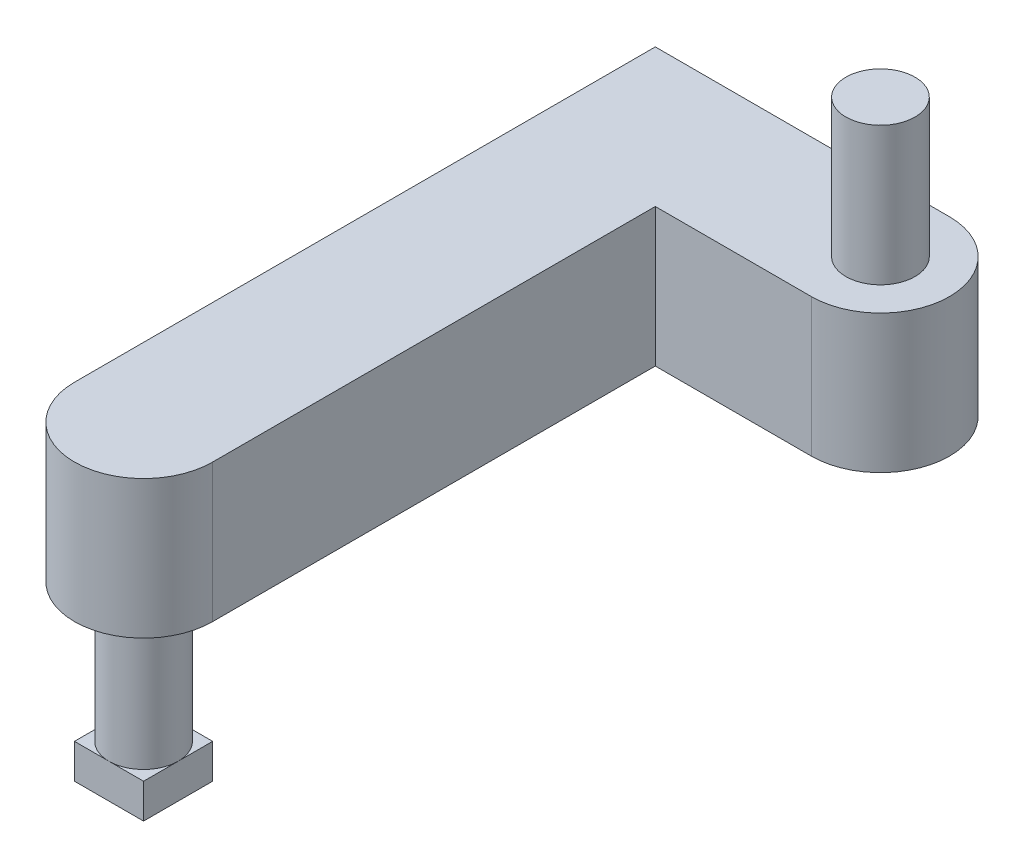
ISO-10303-21;
HEADER;
FILE_DESCRIPTION(('STEP AP214'),'2;1');
FILE_NAME('part.step','',(''),(''),'','','');
FILE_SCHEMA(('AUTOMOTIVE_DESIGN { 1 0 10303 214 1 1 1 1 }'));
ENDSEC;
DATA;
#1=APPLICATION_CONTEXT('core data for automotive mechanical design processes');
#2=APPLICATION_PROTOCOL_DEFINITION('international standard','automotive_design',2000,#1);
#3=PRODUCT_CONTEXT('',#1,'mechanical');
#4=PRODUCT('Part','Part','',(#3));
#5=PRODUCT_RELATED_PRODUCT_CATEGORY('part','',(#4));
#6=PRODUCT_DEFINITION_FORMATION('','',#4);
#7=PRODUCT_DEFINITION_CONTEXT('part definition',#1,'design');
#8=PRODUCT_DEFINITION('design','',#6,#7);
#9=PRODUCT_DEFINITION_SHAPE('','',#8);
#10=(LENGTH_UNIT() NAMED_UNIT(*) SI_UNIT(.MILLI.,.METRE.));
#11=(NAMED_UNIT(*) PLANE_ANGLE_UNIT() SI_UNIT($,.RADIAN.));
#12=(NAMED_UNIT(*) SI_UNIT($,.STERADIAN.) SOLID_ANGLE_UNIT());
#13=UNCERTAINTY_MEASURE_WITH_UNIT(LENGTH_MEASURE(1.E-05),#10,'distance_accuracy_value','');
#14=(GEOMETRIC_REPRESENTATION_CONTEXT(3) GLOBAL_UNCERTAINTY_ASSIGNED_CONTEXT((#13)) GLOBAL_UNIT_ASSIGNED_CONTEXT((#10,
#11,#12)) REPRESENTATION_CONTEXT('',''));
#15=CARTESIAN_POINT('',(0.,0.,0.));
#16=DIRECTION('',(0.,0.,1.));
#17=DIRECTION('',(1.,0.,0.));
#18=AXIS2_PLACEMENT_3D('',#15,#16,#17);
#19=CARTESIAN_POINT('',(-295.,-10.,0.));
#20=DIRECTION('',(-1.,0.,0.));
#21=DIRECTION('',(0.,0.,1.));
#22=AXIS2_PLACEMENT_3D('',#19,#20,#21);
#23=PLANE('',#22);
#24=DIRECTION('',(0.,0.,-1.));
#25=VECTOR('',#24,1.);
#26=CARTESIAN_POINT('',(-295.,-20.,0.));
#27=LINE('',#26,#25);
#28=CARTESIAN_POINT('',(-295.,-20.,632.19854476264));
#29=VERTEX_POINT('',#28);
#30=CARTESIAN_POINT('',(-295.,-20.,590.172180289074));
#31=VERTEX_POINT('',#30);
#32=EDGE_CURVE('E177',#29,#31,#27,.T.);
#33=ORIENTED_EDGE('',*,*,#32,.F.);
#34=DIRECTION('',(0.,-1.,0.));
#35=VECTOR('',#34,1.);
#36=CARTESIAN_POINT('',(-295.,-10.,632.19854476264));
#37=LINE('',#36,#35);
#38=CARTESIAN_POINT('',(-295.,-10.,632.19854476264));
#39=VERTEX_POINT('',#38);
#40=EDGE_CURVE('E42',#39,#29,#37,.T.);
#41=ORIENTED_EDGE('',*,*,#40,.F.);
#42=DIRECTION('',(0.,0.,-1.));
#43=VECTOR('',#42,1.);
#44=CARTESIAN_POINT('',(-295.,-10.,0.));
#45=LINE('',#44,#43);
#46=CARTESIAN_POINT('',(-295.,-10.,590.172180289074));
#47=VERTEX_POINT('',#46);
#48=EDGE_CURVE('E179',#39,#47,#45,.T.);
#49=ORIENTED_EDGE('',*,*,#48,.T.);
#50=DIRECTION('',(0.,-1.,0.));
#51=VECTOR('',#50,1.);
#52=CARTESIAN_POINT('',(-295.,-10.,590.172180289074));
#53=LINE('',#52,#51);
#54=EDGE_CURVE('E195',#47,#31,#53,.T.);
#55=ORIENTED_EDGE('',*,*,#54,.T.);
#56=EDGE_LOOP('',(#33,#41,#49,#55));
#57=FACE_BOUND('',#56,.T.);
#58=ADVANCED_FACE('F35',(#57),#23,.T.);
#59=CARTESIAN_POINT('',(-290.,-10.,632.19854476264));
#60=DIRECTION('',(0.,-1.,0.));
#61=DIRECTION('',(0.,0.,-1.));
#62=AXIS2_PLACEMENT_3D('',#59,#60,#61);
#63=CYLINDRICAL_SURFACE('',#62,5.);
#64=CARTESIAN_POINT('',(-290.,-20.,632.19854476264));
#65=DIRECTION('',(0.,1.,0.));
#66=DIRECTION('',(0.,0.,1.));
#67=AXIS2_PLACEMENT_3D('',#64,#65,#66);
#68=CIRCLE('',#67,5.);
#69=CARTESIAN_POINT('',(-285.,-20.,632.19854476264));
#70=VERTEX_POINT('',#69);
#71=EDGE_CURVE('E198',#70,#29,#68,.F.);
#72=ORIENTED_EDGE('',*,*,#71,.F.);
#73=DIRECTION('',(0.,-1.,0.));
#74=VECTOR('',#73,1.);
#75=CARTESIAN_POINT('',(-285.,-10.,632.19854476264));
#76=LINE('',#75,#74);
#77=CARTESIAN_POINT('',(-285.,-10.,632.19854476264));
#78=VERTEX_POINT('',#77);
#79=EDGE_CURVE('E219',#78,#70,#76,.T.);
#80=ORIENTED_EDGE('',*,*,#79,.F.);
#81=CARTESIAN_POINT('',(-290.,-10.,632.19854476264));
#82=DIRECTION('',(0.,1.,0.));
#83=DIRECTION('',(0.,0.,1.));
#84=AXIS2_PLACEMENT_3D('',#81,#82,#83);
#85=CIRCLE('',#84,5.);
#86=EDGE_CURVE('E182',#78,#39,#85,.F.);
#87=ORIENTED_EDGE('',*,*,#86,.T.);
#88=ORIENTED_EDGE('',*,*,#40,.T.);
#89=EDGE_LOOP('',(#72,#80,#87,#88));
#90=FACE_BOUND('',#89,.T.);
#91=ADVANCED_FACE('F223',(#90),#63,.T.);
#92=CARTESIAN_POINT('',(-285.,-10.,0.));
#93=DIRECTION('',(-1.,0.,0.));
#94=DIRECTION('',(0.,0.,1.));
#95=AXIS2_PLACEMENT_3D('',#92,#93,#94);
#96=PLANE('',#95);
#97=DIRECTION('',(0.,0.,-1.));
#98=VECTOR('',#97,1.);
#99=CARTESIAN_POINT('',(-285.,-20.,0.));
#100=LINE('',#99,#98);
#101=CARTESIAN_POINT('',(-285.,-20.,600.172180289074));
#102=VERTEX_POINT('',#101);
#103=EDGE_CURVE('E201',#70,#102,#100,.T.);
#104=ORIENTED_EDGE('',*,*,#103,.T.);
#105=DIRECTION('',(0.,-1.,0.));
#106=VECTOR('',#105,1.);
#107=CARTESIAN_POINT('',(-285.,-10.,600.172180289074));
#108=LINE('',#107,#106);
#109=CARTESIAN_POINT('',(-285.,-10.,600.172180289074));
#110=VERTEX_POINT('',#109);
#111=EDGE_CURVE('E216',#110,#102,#108,.T.);
#112=ORIENTED_EDGE('',*,*,#111,.F.);
#113=DIRECTION('',(0.,0.,-1.));
#114=VECTOR('',#113,1.);
#115=CARTESIAN_POINT('',(-285.,-10.,0.));
#116=LINE('',#115,#114);
#117=EDGE_CURVE('E186',#78,#110,#116,.T.);
#118=ORIENTED_EDGE('',*,*,#117,.F.);
#119=ORIENTED_EDGE('',*,*,#79,.T.);
#120=EDGE_LOOP('',(#104,#112,#118,#119));
#121=FACE_BOUND('',#120,.T.);
#122=ADVANCED_FACE('F235',(#121),#96,.F.);
#123=CARTESIAN_POINT('',(5.9020530676747E-12,-10.,600.172180289071));
#124=DIRECTION('',(0.,0.,-1.));
#125=DIRECTION('',(-1.,0.,0.));
#126=AXIS2_PLACEMENT_3D('',#123,#124,#125);
#127=PLANE('',#126);
#128=DIRECTION('',(1.,0.,0.));
#129=VECTOR('',#128,1.);
#130=CARTESIAN_POINT('',(5.9020530676747E-12,-20.,600.172180289071));
#131=LINE('',#130,#129);
#132=CARTESIAN_POINT('',(-273.710284952437,-20.,600.172180289074));
#133=VERTEX_POINT('',#132);
#134=EDGE_CURVE('E203',#102,#133,#131,.T.);
#135=ORIENTED_EDGE('',*,*,#134,.T.);
#136=DIRECTION('',(0.,-1.,0.));
#137=VECTOR('',#136,1.);
#138=CARTESIAN_POINT('',(-273.710284952437,-10.,600.172180289074));
#139=LINE('',#138,#137);
#140=CARTESIAN_POINT('',(-273.710284952437,-10.,600.172180289074));
#141=VERTEX_POINT('',#140);
#142=EDGE_CURVE('E213',#141,#133,#139,.T.);
#143=ORIENTED_EDGE('',*,*,#142,.F.);
#144=DIRECTION('',(1.,0.,0.));
#145=VECTOR('',#144,1.);
#146=CARTESIAN_POINT('',(5.9020530676747E-12,-10.,600.172180289071));
#147=LINE('',#146,#145);
#148=EDGE_CURVE('E188',#110,#141,#147,.T.);
#149=ORIENTED_EDGE('',*,*,#148,.F.);
#150=ORIENTED_EDGE('',*,*,#111,.T.);
#151=EDGE_LOOP('',(#135,#143,#149,#150));
#152=FACE_BOUND('',#151,.T.);
#153=ADVANCED_FACE('F239',(#152),#127,.F.);
#154=CARTESIAN_POINT('',(-273.710284952437,-10.,595.172180289074));
#155=DIRECTION('',(0.,-1.,0.));
#156=DIRECTION('',(0.,0.,-1.));
#157=AXIS2_PLACEMENT_3D('',#154,#155,#156);
#158=CYLINDRICAL_SURFACE('',#157,5.);
#159=CARTESIAN_POINT('',(-273.710284952437,-20.,595.172180289074));
#160=DIRECTION('',(0.,1.,0.));
#161=DIRECTION('',(0.,0.,1.));
#162=AXIS2_PLACEMENT_3D('',#159,#160,#161);
#163=CIRCLE('',#162,5.);
#164=CARTESIAN_POINT('',(-273.710284952437,-20.,590.172180289074));
#165=VERTEX_POINT('',#164);
#166=EDGE_CURVE('E205',#133,#165,#163,.T.);
#167=ORIENTED_EDGE('',*,*,#166,.T.);
#168=DIRECTION('',(0.,-1.,0.));
#169=VECTOR('',#168,1.);
#170=CARTESIAN_POINT('',(-273.710284952437,-10.,590.172180289074));
#171=LINE('',#170,#169);
#172=CARTESIAN_POINT('',(-273.710284952437,-10.,590.172180289074));
#173=VERTEX_POINT('',#172);
#174=EDGE_CURVE('E211',#173,#165,#171,.T.);
#175=ORIENTED_EDGE('',*,*,#174,.F.);
#176=CARTESIAN_POINT('',(-273.710284952437,-10.,595.172180289074));
#177=DIRECTION('',(0.,1.,0.));
#178=DIRECTION('',(0.,0.,1.));
#179=AXIS2_PLACEMENT_3D('',#176,#177,#178);
#180=CIRCLE('',#179,5.);
#181=EDGE_CURVE('E190',#141,#173,#180,.T.);
#182=ORIENTED_EDGE('',*,*,#181,.F.);
#183=ORIENTED_EDGE('',*,*,#142,.T.);
#184=EDGE_LOOP('',(#167,#175,#182,#183));
#185=FACE_BOUND('',#184,.T.);
#186=ADVANCED_FACE('F249',(#185),#158,.T.);
#187=CARTESIAN_POINT('',(3.07764919157606E-12,-10.,590.172180289072));
#188=DIRECTION('',(0.,0.,-1.));
#189=DIRECTION('',(-1.,0.,0.));
#190=AXIS2_PLACEMENT_3D('',#187,#188,#189);
#191=PLANE('',#190);
#192=DIRECTION('',(1.,0.,0.));
#193=VECTOR('',#192,1.);
#194=CARTESIAN_POINT('',(3.07764919157606E-12,-20.,590.172180289072));
#195=LINE('',#194,#193);
#196=EDGE_CURVE('E183',#31,#165,#195,.T.);
#197=ORIENTED_EDGE('',*,*,#196,.F.);
#198=ORIENTED_EDGE('',*,*,#54,.F.);
#199=DIRECTION('',(1.,0.,0.));
#200=VECTOR('',#199,1.);
#201=CARTESIAN_POINT('',(3.07764919157606E-12,-10.,590.172180289072));
#202=LINE('',#201,#200);
#203=EDGE_CURVE('E192',#47,#173,#202,.T.);
#204=ORIENTED_EDGE('',*,*,#203,.T.);
#205=ORIENTED_EDGE('',*,*,#174,.T.);
#206=EDGE_LOOP('',(#197,#198,#204,#205));
#207=FACE_BOUND('',#206,.T.);
#208=ADVANCED_FACE('F247',(#207),#191,.T.);
#209=CARTESIAN_POINT('',(0.,-10.,0.));
#210=DIRECTION('',(0.,1.,0.));
#211=DIRECTION('',(0.,0.,1.));
#212=AXIS2_PLACEMENT_3D('',#209,#210,#211);
#213=PLANE('',#212);
#214=CARTESIAN_POINT('',(-273.710284952437,-10.,595.172180289074));
#215=DIRECTION('',(0.,1.,0.));
#216=DIRECTION('',(0.,0.,1.));
#217=AXIS2_PLACEMENT_3D('',#214,#215,#216);
#218=CIRCLE('',#217,2.50000000000002);
#219=CARTESIAN_POINT('',(-273.710284952437,-10.,597.672180289074));
#220=VERTEX_POINT('',#219);
#221=EDGE_CURVE('E154',#220,#220,#218,.F.);
#222=ORIENTED_EDGE('',*,*,#221,.T.);
#223=EDGE_LOOP('',(#222));
#224=FACE_BOUND('',#223,.T.);
#225=ORIENTED_EDGE('',*,*,#48,.F.);
#226=ORIENTED_EDGE('',*,*,#86,.F.);
#227=ORIENTED_EDGE('',*,*,#117,.T.);
#228=ORIENTED_EDGE('',*,*,#148,.T.);
#229=ORIENTED_EDGE('',*,*,#181,.T.);
#230=ORIENTED_EDGE('',*,*,#203,.F.);
#231=EDGE_LOOP('',(#225,#226,#227,#228,#229,#230));
#232=FACE_BOUND('',#231,.T.);
#233=ADVANCED_FACE('F243',(#224,#232),#213,.T.);
#234=CARTESIAN_POINT('',(0.,-20.,0.));
#235=DIRECTION('',(0.,1.,0.));
#236=DIRECTION('',(0.,0.,1.));
#237=AXIS2_PLACEMENT_3D('',#234,#235,#236);
#238=PLANE('',#237);
#239=CARTESIAN_POINT('',(-290.,-20.,632.19854476264));
#240=DIRECTION('',(0.,1.,0.));
#241=DIRECTION('',(0.,0.,1.));
#242=AXIS2_PLACEMENT_3D('',#239,#240,#241);
#243=CIRCLE('',#242,2.49999999999995);
#244=CARTESIAN_POINT('',(-290.,-20.,634.69854476264));
#245=VERTEX_POINT('',#244);
#246=EDGE_CURVE('E11',#245,#245,#243,.F.);
#247=ORIENTED_EDGE('',*,*,#246,.F.);
#248=EDGE_LOOP('',(#247));
#249=FACE_BOUND('',#248,.T.);
#250=ORIENTED_EDGE('',*,*,#32,.T.);
#251=ORIENTED_EDGE('',*,*,#196,.T.);
#252=ORIENTED_EDGE('',*,*,#166,.F.);
#253=ORIENTED_EDGE('',*,*,#134,.F.);
#254=ORIENTED_EDGE('',*,*,#103,.F.);
#255=ORIENTED_EDGE('',*,*,#71,.T.);
#256=EDGE_LOOP('',(#250,#251,#252,#253,#254,#255));
#257=FACE_BOUND('',#256,.T.);
#258=ADVANCED_FACE('F230',(#249,#257),#238,.F.);
#259=CARTESIAN_POINT('',(-290.,-30.,632.19854476264));
#260=DIRECTION('',(0.,1.,0.));
#261=DIRECTION('',(0.,0.,1.));
#262=AXIS2_PLACEMENT_3D('',#259,#260,#261);
#263=CYLINDRICAL_SURFACE('',#262,2.49999999999995);
#264=CARTESIAN_POINT('',(-290.,-30.,632.19854476264));
#265=DIRECTION('',(0.,1.,0.));
#266=DIRECTION('',(0.,0.,1.));
#267=AXIS2_PLACEMENT_3D('',#264,#265,#266);
#268=CIRCLE('',#267,2.49999999999995);
#269=CARTESIAN_POINT('',(-290.,-30.,634.69854476264));
#270=VERTEX_POINT('',#269);
#271=CARTESIAN_POINT('',(-292.5,-30.,632.19854476264));
#272=VERTEX_POINT('',#271);
#273=EDGE_CURVE('E174',#270,#272,#268,.F.);
#274=ORIENTED_EDGE('',*,*,#273,.F.);
#275=CARTESIAN_POINT('',(-287.5,-30.,632.19854476264));
#276=VERTEX_POINT('',#275);
#277=EDGE_CURVE('E49',#276,#270,#268,.F.);
#278=ORIENTED_EDGE('',*,*,#277,.F.);
#279=CARTESIAN_POINT('',(-290.,-30.,629.69854476264));
#280=VERTEX_POINT('',#279);
#281=EDGE_CURVE('E53',#280,#276,#268,.F.);
#282=ORIENTED_EDGE('',*,*,#281,.F.);
#283=EDGE_CURVE('E178',#272,#280,#268,.F.);
#284=ORIENTED_EDGE('',*,*,#283,.F.);
#285=EDGE_LOOP('',(#274,#278,#282,#284));
#286=FACE_BOUND('',#285,.T.);
#287=ORIENTED_EDGE('',*,*,#246,.T.);
#288=EDGE_LOOP('',(#287));
#289=FACE_BOUND('',#288,.T.);
#290=ADVANCED_FACE('F310',(#286,#289),#263,.T.);
#291=CARTESIAN_POINT('',(0.,-30.,0.));
#292=DIRECTION('',(0.,1.,0.));
#293=DIRECTION('',(0.,0.,1.));
#294=AXIS2_PLACEMENT_3D('',#291,#292,#293);
#295=PLANE('',#294);
#296=DIRECTION('',(1.,0.,0.));
#297=VECTOR('',#296,1.);
#298=CARTESIAN_POINT('',(0.,-30.,634.69854476264));
#299=LINE('',#298,#297);
#300=CARTESIAN_POINT('',(-292.5,-30.,634.69854476264));
#301=VERTEX_POINT('',#300);
#302=EDGE_CURVE('E159',#301,#270,#299,.T.);
#303=ORIENTED_EDGE('',*,*,#302,.T.);
#304=ORIENTED_EDGE('',*,*,#273,.T.);
#305=DIRECTION('',(0.,0.,-1.));
#306=VECTOR('',#305,1.);
#307=CARTESIAN_POINT('',(-292.5,-30.,0.));
#308=LINE('',#307,#306);
#309=EDGE_CURVE('E148',#301,#272,#308,.T.);
#310=ORIENTED_EDGE('',*,*,#309,.F.);
#311=EDGE_LOOP('',(#303,#304,#310));
#312=FACE_BOUND('',#311,.T.);
#313=ADVANCED_FACE('F327',(#312),#295,.T.);
#314=CARTESIAN_POINT('',(-292.5,-30.,629.69854476264));
#315=VERTEX_POINT('',#314);
#316=EDGE_CURVE('E151',#272,#315,#308,.T.);
#317=ORIENTED_EDGE('',*,*,#316,.F.);
#318=ORIENTED_EDGE('',*,*,#283,.T.);
#319=DIRECTION('',(1.,0.,0.));
#320=VECTOR('',#319,1.);
#321=CARTESIAN_POINT('',(0.,-30.,629.69854476264));
#322=LINE('',#321,#320);
#323=EDGE_CURVE('E166',#315,#280,#322,.T.);
#324=ORIENTED_EDGE('',*,*,#323,.F.);
#325=EDGE_LOOP('',(#317,#318,#324));
#326=FACE_BOUND('',#325,.T.);
#327=ADVANCED_FACE('F339',(#326),#295,.T.);
#328=CARTESIAN_POINT('',(-287.5,-30.,629.69854476264));
#329=VERTEX_POINT('',#328);
#330=EDGE_CURVE('E165',#280,#329,#322,.T.);
#331=ORIENTED_EDGE('',*,*,#330,.F.);
#332=ORIENTED_EDGE('',*,*,#281,.T.);
#333=DIRECTION('',(0.,0.,-1.));
#334=VECTOR('',#333,1.);
#335=CARTESIAN_POINT('',(-287.5,-30.,0.));
#336=LINE('',#335,#334);
#337=EDGE_CURVE('E162',#276,#329,#336,.T.);
#338=ORIENTED_EDGE('',*,*,#337,.T.);
#339=EDGE_LOOP('',(#331,#332,#338));
#340=FACE_BOUND('',#339,.T.);
#341=ADVANCED_FACE('F350',(#340),#295,.T.);
#342=CARTESIAN_POINT('',(0.,-32.5,634.69854476264));
#343=DIRECTION('',(0.,0.,1.));
#344=DIRECTION('',(1.,0.,0.));
#345=AXIS2_PLACEMENT_3D('',#342,#343,#344);
#346=PLANE('',#345);
#347=ORIENTED_EDGE('',*,*,#302,.F.);
#348=DIRECTION('',(0.,1.,0.));
#349=VECTOR('',#348,1.);
#350=CARTESIAN_POINT('',(-292.5,-32.5,634.69854476264));
#351=LINE('',#350,#349);
#352=CARTESIAN_POINT('',(-292.5,-32.5,634.69854476264));
#353=VERTEX_POINT('',#352);
#354=EDGE_CURVE('E146',#353,#301,#351,.T.);
#355=ORIENTED_EDGE('',*,*,#354,.F.);
#356=DIRECTION('',(1.,0.,0.));
#357=VECTOR('',#356,1.);
#358=CARTESIAN_POINT('',(0.,-32.5,634.69854476264));
#359=LINE('',#358,#357);
#360=CARTESIAN_POINT('',(-287.5,-32.5,634.69854476264));
#361=VERTEX_POINT('',#360);
#362=EDGE_CURVE('E139',#353,#361,#359,.T.);
#363=ORIENTED_EDGE('',*,*,#362,.T.);
#364=DIRECTION('',(0.,1.,0.));
#365=VECTOR('',#364,1.);
#366=CARTESIAN_POINT('',(-287.5,-32.5,634.69854476264));
#367=LINE('',#366,#365);
#368=CARTESIAN_POINT('',(-287.5,-30.,634.69854476264));
#369=VERTEX_POINT('',#368);
#370=EDGE_CURVE('E122',#361,#369,#367,.T.);
#371=ORIENTED_EDGE('',*,*,#370,.T.);
#372=EDGE_CURVE('E163',#270,#369,#299,.T.);
#373=ORIENTED_EDGE('',*,*,#372,.F.);
#374=EDGE_LOOP('',(#347,#355,#363,#371,#373));
#375=FACE_BOUND('',#374,.T.);
#376=ADVANCED_FACE('F145',(#375),#346,.T.);
#377=CARTESIAN_POINT('',(-292.5,-32.5,0.));
#378=DIRECTION('',(1.,0.,0.));
#379=DIRECTION('',(0.,0.,-1.));
#380=AXIS2_PLACEMENT_3D('',#377,#378,#379);
#381=PLANE('',#380);
#382=ORIENTED_EDGE('',*,*,#309,.T.);
#383=ORIENTED_EDGE('',*,*,#316,.T.);
#384=DIRECTION('',(0.,1.,0.));
#385=VECTOR('',#384,1.);
#386=CARTESIAN_POINT('',(-292.5,-32.5,629.69854476264));
#387=LINE('',#386,#385);
#388=CARTESIAN_POINT('',(-292.5,-32.5,629.69854476264));
#389=VERTEX_POINT('',#388);
#390=EDGE_CURVE('E170',#389,#315,#387,.T.);
#391=ORIENTED_EDGE('',*,*,#390,.F.);
#392=DIRECTION('',(0.,0.,-1.));
#393=VECTOR('',#392,1.);
#394=CARTESIAN_POINT('',(-292.5,-32.5,0.));
#395=LINE('',#394,#393);
#396=EDGE_CURVE('E134',#353,#389,#395,.T.);
#397=ORIENTED_EDGE('',*,*,#396,.F.);
#398=ORIENTED_EDGE('',*,*,#354,.T.);
#399=EDGE_LOOP('',(#382,#383,#391,#397,#398));
#400=FACE_BOUND('',#399,.T.);
#401=ADVANCED_FACE('F367',(#400),#381,.F.);
#402=CARTESIAN_POINT('',(0.,-32.5,629.69854476264));
#403=DIRECTION('',(0.,0.,1.));
#404=DIRECTION('',(1.,0.,0.));
#405=AXIS2_PLACEMENT_3D('',#402,#403,#404);
#406=PLANE('',#405);
#407=ORIENTED_EDGE('',*,*,#323,.T.);
#408=ORIENTED_EDGE('',*,*,#330,.T.);
#409=DIRECTION('',(0.,1.,0.));
#410=VECTOR('',#409,1.);
#411=CARTESIAN_POINT('',(-287.5,-32.5,629.69854476264));
#412=LINE('',#411,#410);
#413=CARTESIAN_POINT('',(-287.5,-32.5,629.69854476264));
#414=VERTEX_POINT('',#413);
#415=EDGE_CURVE('E133',#414,#329,#412,.T.);
#416=ORIENTED_EDGE('',*,*,#415,.F.);
#417=DIRECTION('',(1.,0.,0.));
#418=VECTOR('',#417,1.);
#419=CARTESIAN_POINT('',(0.,-32.5,629.69854476264));
#420=LINE('',#419,#418);
#421=EDGE_CURVE('E141',#389,#414,#420,.T.);
#422=ORIENTED_EDGE('',*,*,#421,.F.);
#423=ORIENTED_EDGE('',*,*,#390,.T.);
#424=EDGE_LOOP('',(#407,#408,#416,#422,#423));
#425=FACE_BOUND('',#424,.T.);
#426=ADVANCED_FACE('F376',(#425),#406,.F.);
#427=CARTESIAN_POINT('',(-287.5,-32.5,0.));
#428=DIRECTION('',(1.,0.,0.));
#429=DIRECTION('',(0.,0.,-1.));
#430=AXIS2_PLACEMENT_3D('',#427,#428,#429);
#431=PLANE('',#430);
#432=EDGE_CURVE('E129',#369,#276,#336,.T.);
#433=ORIENTED_EDGE('',*,*,#432,.F.);
#434=ORIENTED_EDGE('',*,*,#370,.F.);
#435=DIRECTION('',(0.,0.,-1.));
#436=VECTOR('',#435,1.);
#437=CARTESIAN_POINT('',(-287.5,-32.5,0.));
#438=LINE('',#437,#436);
#439=EDGE_CURVE('E126',#361,#414,#438,.T.);
#440=ORIENTED_EDGE('',*,*,#439,.T.);
#441=ORIENTED_EDGE('',*,*,#415,.T.);
#442=ORIENTED_EDGE('',*,*,#337,.F.);
#443=EDGE_LOOP('',(#433,#434,#440,#441,#442));
#444=FACE_BOUND('',#443,.T.);
#445=ADVANCED_FACE('F124',(#444),#431,.T.);
#446=CARTESIAN_POINT('',(0.,-32.5,0.));
#447=DIRECTION('',(0.,1.,0.));
#448=DIRECTION('',(0.,0.,1.));
#449=AXIS2_PLACEMENT_3D('',#446,#447,#448);
#450=PLANE('',#449);
#451=ORIENTED_EDGE('',*,*,#362,.F.);
#452=ORIENTED_EDGE('',*,*,#396,.T.);
#453=ORIENTED_EDGE('',*,*,#421,.T.);
#454=ORIENTED_EDGE('',*,*,#439,.F.);
#455=EDGE_LOOP('',(#451,#452,#453,#454));
#456=FACE_BOUND('',#455,.T.);
#457=ADVANCED_FACE('F138',(#456),#450,.F.);
#458=ORIENTED_EDGE('',*,*,#432,.T.);
#459=ORIENTED_EDGE('',*,*,#277,.T.);
#460=ORIENTED_EDGE('',*,*,#372,.T.);
#461=EDGE_LOOP('',(#458,#459,#460));
#462=FACE_BOUND('',#461,.T.);
#463=ADVANCED_FACE('F342',(#462),#295,.T.);
#464=CARTESIAN_POINT('',(-273.710284952437,0.,595.172180289074));
#465=DIRECTION('',(0.,-1.,0.));
#466=DIRECTION('',(0.,0.,-1.));
#467=AXIS2_PLACEMENT_3D('',#464,#465,#466);
#468=CYLINDRICAL_SURFACE('',#467,2.50000000000002);
#469=ORIENTED_EDGE('',*,*,#221,.F.);
#470=EDGE_LOOP('',(#469));
#471=FACE_BOUND('',#470,.T.);
#472=CARTESIAN_POINT('',(-273.710284952437,0.,595.172180289074));
#473=DIRECTION('',(0.,1.,0.));
#474=DIRECTION('',(0.,0.,1.));
#475=AXIS2_PLACEMENT_3D('',#472,#473,#474);
#476=CIRCLE('',#475,2.50000000000002);
#477=CARTESIAN_POINT('',(-273.710284952437,0.,597.672180289074));
#478=VERTEX_POINT('',#477);
#479=EDGE_CURVE('E433',#478,#478,#476,.T.);
#480=ORIENTED_EDGE('',*,*,#479,.F.);
#481=EDGE_LOOP('',(#480));
#482=FACE_BOUND('',#481,.T.);
#483=ADVANCED_FACE('F410',(#471,#482),#468,.T.);
#484=CARTESIAN_POINT('',(0.,0.,0.));
#485=DIRECTION('',(0.,1.,0.));
#486=DIRECTION('',(0.,0.,1.));
#487=AXIS2_PLACEMENT_3D('',#484,#485,#486);
#488=PLANE('',#487);
#489=ORIENTED_EDGE('',*,*,#479,.T.);
#490=EDGE_LOOP('',(#489));
#491=FACE_BOUND('',#490,.T.);
#492=ADVANCED_FACE('F418',(#491),#488,.T.);
#493=CLOSED_SHELL('',(#58,#91,#122,#153,#186,#208,#233,#258,#290,#313,#327,#341,#376,#401,#426,
#445,#457,#463,#483,#492));
#494=MANIFOLD_SOLID_BREP('B2',#493);
#495=ADVANCED_BREP_SHAPE_REPRESENTATION('',(#18,#494),#14);
#496=SHAPE_DEFINITION_REPRESENTATION(#9,#495);
ENDSEC;
END-ISO-10303-21;
